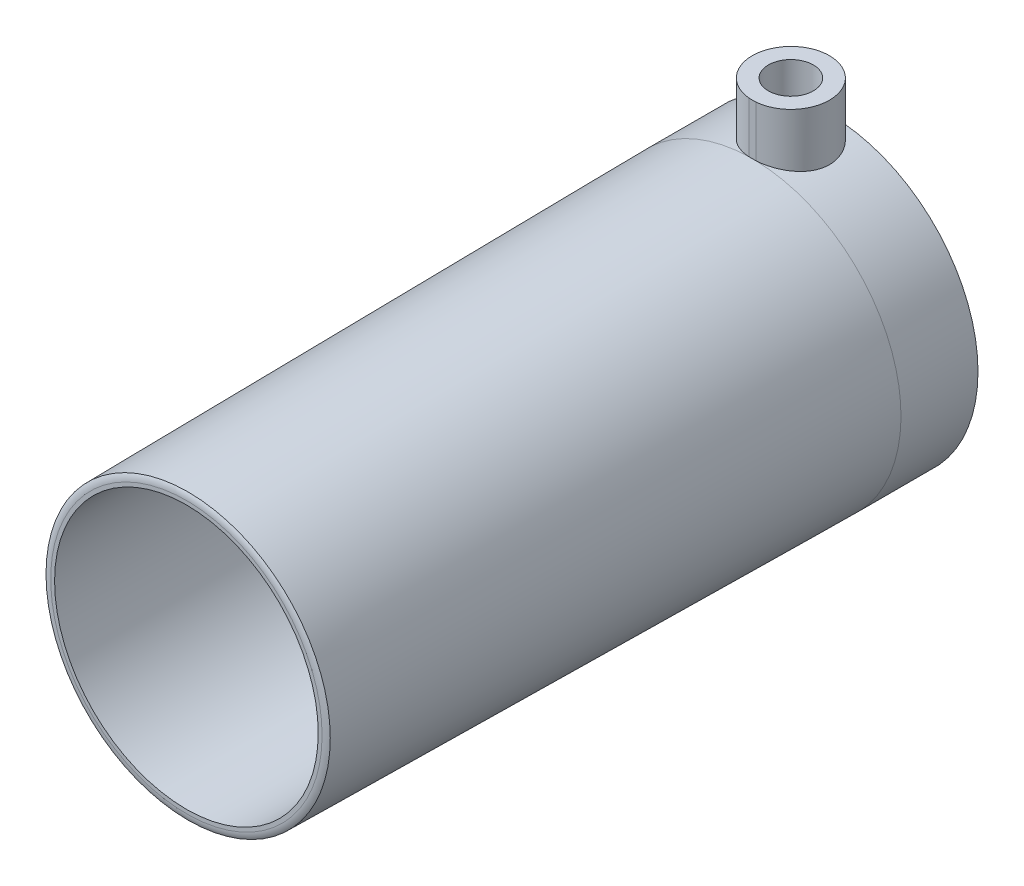
ISO-10303-21;
HEADER;
FILE_DESCRIPTION(('STEP AP214'),'2;1');
FILE_NAME('part.step','',(''),(''),'','','');
FILE_SCHEMA(('AUTOMOTIVE_DESIGN { 1 0 10303 214 1 1 1 1 }'));
ENDSEC;
DATA;
#1=APPLICATION_CONTEXT('core data for automotive mechanical design processes');
#2=APPLICATION_PROTOCOL_DEFINITION('international standard','automotive_design',2000,#1);
#3=PRODUCT_CONTEXT('',#1,'mechanical');
#4=PRODUCT('Part','Part','',(#3));
#5=PRODUCT_RELATED_PRODUCT_CATEGORY('part','',(#4));
#6=PRODUCT_DEFINITION_FORMATION('','',#4);
#7=PRODUCT_DEFINITION_CONTEXT('part definition',#1,'design');
#8=PRODUCT_DEFINITION('design','',#6,#7);
#9=PRODUCT_DEFINITION_SHAPE('','',#8);
#10=(LENGTH_UNIT() NAMED_UNIT(*) SI_UNIT(.MILLI.,.METRE.));
#11=(NAMED_UNIT(*) PLANE_ANGLE_UNIT() SI_UNIT($,.RADIAN.));
#12=(NAMED_UNIT(*) SI_UNIT($,.STERADIAN.) SOLID_ANGLE_UNIT());
#13=UNCERTAINTY_MEASURE_WITH_UNIT(LENGTH_MEASURE(1.E-05),#10,'distance_accuracy_value','');
#14=(GEOMETRIC_REPRESENTATION_CONTEXT(3) GLOBAL_UNCERTAINTY_ASSIGNED_CONTEXT((#13)) GLOBAL_UNIT_ASSIGNED_CONTEXT((#10,
#11,#12)) REPRESENTATION_CONTEXT('',''));
#15=CARTESIAN_POINT('',(0.,0.,0.));
#16=DIRECTION('',(0.,0.,1.));
#17=DIRECTION('',(1.,0.,0.));
#18=AXIS2_PLACEMENT_3D('',#15,#16,#17);
#19=CARTESIAN_POINT('',(0.,0.,100.));
#20=DIRECTION('',(0.,0.,-1.));
#21=DIRECTION('',(-1.,0.,0.));
#22=AXIS2_PLACEMENT_3D('',#19,#20,#21);
#23=CYLINDRICAL_SURFACE('',#22,23.1);
#24=CARTESIAN_POINT('',(0.,23.1,0.));
#25=CARTESIAN_POINT('',(-0.165590971193662,23.1000033344934,-5.35518259983517E-06));
#26=CARTESIAN_POINT('',(-0.33112499055556,23.0982169144309,0.00685592480967632));
#27=CARTESIAN_POINT('',(-0.661030895235251,23.0911284661715,0.0342299650651712));
#28=CARTESIAN_POINT('',(-0.825402660446663,23.0858260798523,0.0547441159558147));
#29=CARTESIAN_POINT('',(-1.15178290254947,23.0718464923373,0.109262589978207));
#30=CARTESIAN_POINT('',(-1.3137907400409,23.0631683950062,0.143270495286467));
#31=CARTESIAN_POINT('',(-1.63431832520702,23.0426734576403,0.224504741525706));
#32=CARTESIAN_POINT('',(-1.79283676328674,23.0308554602172,0.271735957003892));
#33=CARTESIAN_POINT('',(-2.1049667073609,23.0044258809035,0.378941236228669));
#34=CARTESIAN_POINT('',(-2.2585858677927,22.9898189338606,0.438894176386552));
#35=CARTESIAN_POINT('',(-2.56021914242264,22.9581855742689,0.571150488054531));
#36=CARTESIAN_POINT('',(-2.70823116187722,22.9411582685824,0.643458420685275));
#37=CARTESIAN_POINT('',(-2.99757832644708,22.9051473414502,0.799849953336694));
#38=CARTESIAN_POINT('',(-3.13891576371196,22.8861643988297,0.883929470912736));
#39=CARTESIAN_POINT('',(-3.41412560213961,22.8467302052023,1.06332717903448));
#40=CARTESIAN_POINT('',(-3.54799516542336,22.8262784026744,1.15864959973455));
#41=CARTESIAN_POINT('',(-3.80990901739636,22.7840411827221,1.36183267777111));
#42=CARTESIAN_POINT('',(-3.93778892210403,22.7622375420801,1.46990149429716));
#43=CARTESIAN_POINT('',(-4.18408667386697,22.7182542847428,1.6963486333101));
#44=CARTESIAN_POINT('',(-4.30250099190803,22.6960745315242,1.81473076680789));
#45=CARTESIAN_POINT('',(-4.52901878352585,22.6519602492384,2.06096874280303));
#46=CARTESIAN_POINT('',(-4.63712476840375,22.6300256615996,2.18882226433867));
#47=CARTESIAN_POINT('',(-4.84237672302797,22.5869960390746,2.45325333550688));
#48=CARTESIAN_POINT('',(-4.93951863053512,22.5659013172239,2.5898340894562));
#49=CARTESIAN_POINT('',(-5.12357451546836,22.5248311972553,2.87302867221965));
#50=CARTESIAN_POINT('',(-5.21030186762009,22.5048788544462,3.01976725953834));
#51=CARTESIAN_POINT('',(-5.37108653776012,22.4670481602831,3.32035470076489));
#52=CARTESIAN_POINT('',(-5.4451390545621,22.4491705956702,3.47420622112392));
#53=CARTESIAN_POINT('',(-5.57991539131063,22.4160517312993,3.78784332546131));
#54=CARTESIAN_POINT('',(-5.64064597169605,22.4008090952393,3.94762585129302));
#55=CARTESIAN_POINT('',(-5.74833679001229,22.3734141992353,4.27202076478242));
#56=CARTESIAN_POINT('',(-5.79529211197796,22.36126304275,4.4366348536782));
#57=CARTESIAN_POINT('',(-5.91305057834968,22.3305330908732,4.92877189248703));
#58=CARTESIAN_POINT('',(-5.96381923736484,22.3168941662465,5.26177578049617));
#59=CARTESIAN_POINT('',(-5.9977091255718,22.307788842108,5.76376310679579));
#60=CARTESIAN_POINT('',(-6.00195546600065,22.3066476406758,5.93157013966998));
#61=CARTESIAN_POINT('',(-5.99640224065119,22.3081415255425,6.26695528142369));
#62=CARTESIAN_POINT('',(-5.98660255383401,22.3107766443831,6.43453338831803));
#63=CARTESIAN_POINT('',(-5.93705327961186,22.3240412095715,6.926133212339));
#64=CARTESIAN_POINT('',(-5.87774660526282,22.3398735969893,7.24826133471414));
#65=CARTESIAN_POINT('',(-5.70796101759669,22.3838491779772,7.87765915444684));
#66=CARTESIAN_POINT('',(-5.59747820182715,22.4119933103741,8.18492771671029));
#67=CARTESIAN_POINT('',(-5.32726609595897,22.4777601147131,8.77994622679621));
#68=CARTESIAN_POINT('',(-5.16701857753113,22.5154817307646,9.06744995056467));
#69=CARTESIAN_POINT('',(-4.80218797808098,22.5961012679159,9.61199019637121));
#70=CARTESIAN_POINT('',(-4.59759657651588,22.6390001597925,9.86902098654554));
#71=CARTESIAN_POINT('',(-4.14239688839971,22.7267639880377,10.3536680227197));
#72=CARTESIAN_POINT('',(-3.89056285258569,22.7716487318296,10.5801310653492));
#73=CARTESIAN_POINT('',(-3.35194754542449,22.8571365154719,10.9878385800343));
#74=CARTESIAN_POINT('',(-3.06516503345578,22.897739403227,11.1690814461413));
#75=CARTESIAN_POINT('',(-2.46306694783088,22.9703175823708,11.4816768689414));
#76=CARTESIAN_POINT('',(-2.14764326630369,23.0022582032135,11.612829771763));
#77=CARTESIAN_POINT('',(-1.49820754167958,23.0536618502468,11.8199201996727));
#78=CARTESIAN_POINT('',(-1.16419936107903,23.0731274587233,11.8958691522308));
#79=CARTESIAN_POINT('',(-0.496926059234522,23.0970008516725,11.9886060011944));
#80=CARTESIAN_POINT('',(-0.163892965126738,23.10180790035,12.0069629771434));
#81=CARTESIAN_POINT('',(0.500490365438129,23.0969659166636,11.988315352029));
#82=CARTESIAN_POINT('',(0.831840763106455,23.0873182963891,11.9513161587592));
#83=CARTESIAN_POINT('',(1.47791500227641,23.0549080562859,11.8242966021679));
#84=CARTESIAN_POINT('',(1.79282106228187,23.0323600397174,11.7351433103876));
#85=CARTESIAN_POINT('',(2.40318369544935,22.976699330229,11.5073450298025));
#86=CARTESIAN_POINT('',(2.69863821465691,22.9435855237827,11.368694824346));
#87=CARTESIAN_POINT('',(3.26786837214201,22.8695221085103,11.0428774473916));
#88=CARTESIAN_POINT('',(3.5411311900568,22.8284367231709,10.8548460630205));
#89=CARTESIAN_POINT('',(4.05278199450715,22.7431825437095,10.4366813975085));
#90=CARTESIAN_POINT('',(4.29116344456352,22.6990131739593,10.2065402434832));
#91=CARTESIAN_POINT('',(4.73281745739942,22.6111160299583,9.70344387799583));
#92=CARTESIAN_POINT('',(4.93498513746379,22.5674313900394,9.42951116996765));
#93=CARTESIAN_POINT('',(5.29054401188716,22.4867421531345,8.85050106199441));
#94=CARTESIAN_POINT('',(5.44393731179001,22.4497372678197,8.54542500722946));
#95=CARTESIAN_POINT('',(5.63337945269746,22.4026596530521,8.07215787168723));
#96=CARTESIAN_POINT('',(5.68966382213905,22.3883967264562,7.91220323117818));
#97=CARTESIAN_POINT('',(5.78854795585899,22.3630351429941,7.58789025590354));
#98=CARTESIAN_POINT('',(5.83115294097036,22.3519352791052,7.42353362719702));
#99=CARTESIAN_POINT('',(5.90230399553967,22.3332522926066,7.09161812152249));
#100=CARTESIAN_POINT('',(5.93085005459387,22.3256691725993,6.92405924218488));
#101=CARTESIAN_POINT('',(5.97363232175377,22.3142602555883,6.58699977451459));
#102=CARTESIAN_POINT('',(5.98786923525893,22.3104342733688,6.41749928231448));
#103=CARTESIAN_POINT('',(6.00168389058807,22.3067217998155,6.08314384510501));
#104=CARTESIAN_POINT('',(6.00170359526212,22.3067165358045,5.91830829454127));
#105=CARTESIAN_POINT('',(5.98818749650133,22.3103487152634,5.58923702964712));
#106=CARTESIAN_POINT('',(5.97465201566056,22.3139860720442,5.42500130113516));
#107=CARTESIAN_POINT('',(5.93414026194278,22.3247937778621,5.09829070816489));
#108=CARTESIAN_POINT('',(5.90716197960805,22.3319646550954,4.93581611067521));
#109=CARTESIAN_POINT('',(5.84000496066206,22.3496206892443,4.61386373054505));
#110=CARTESIAN_POINT('',(5.79983086742773,22.3601046802836,4.45438491457993));
#111=CARTESIAN_POINT('',(5.70691943075746,22.3839976989102,4.14051615174255));
#112=CARTESIAN_POINT('',(5.65426725195231,22.3973868482459,3.98609945217393));
#113=CARTESIAN_POINT('',(5.53668877719655,22.4267417340091,3.6823300293741));
#114=CARTESIAN_POINT('',(5.47176672344004,22.4427065796354,3.53297557690413));
#115=CARTESIAN_POINT('',(5.3300821151908,22.4767776311702,3.24016478525328));
#116=CARTESIAN_POINT('',(5.25331416277645,22.4948848124133,3.0967111728931));
#117=CARTESIAN_POINT('',(5.0885239904093,22.5327331971767,2.81671478128699));
#118=CARTESIAN_POINT('',(5.00050542329341,22.5524738696067,2.68016977895809));
#119=CARTESIAN_POINT('',(4.81112566652018,22.5936433779676,2.41100133835447));
#120=CARTESIAN_POINT('',(4.7094565955667,22.6151042318365,2.27859932456933));
#121=CARTESIAN_POINT('',(4.49553545769871,22.6585980831307,2.02282150121021));
#122=CARTESIAN_POINT('',(4.38328696980326,22.6806308852512,1.89944266400065));
#123=CARTESIAN_POINT('',(4.14883978854604,22.724686126973,1.66238140820608));
#124=CARTESIAN_POINT('',(4.02663525019929,22.7467085527409,1.54870476692731));
#125=CARTESIAN_POINT('',(3.77316529907347,22.7901239172101,1.33191414690676));
#126=CARTESIAN_POINT('',(3.64190318824883,22.8115170812956,1.22879635261531));
#127=CARTESIAN_POINT('',(3.36835049527036,22.8535280938887,1.03178093443652));
#128=CARTESIAN_POINT('',(3.22588951870712,22.8741212114616,0.938114409357443));
#129=CARTESIAN_POINT('',(2.93338079331094,22.9134686926439,0.763177456835652));
#130=CARTESIAN_POINT('',(2.78333585769176,22.9322237305977,0.681902477126101));
#131=CARTESIAN_POINT('',(2.47669235266102,22.9673634501192,0.532361421855631));
#132=CARTESIAN_POINT('',(2.32009637458694,22.983749057722,0.464090260735977));
#133=CARTESIAN_POINT('',(2.00146722455376,23.0136866104515,0.341085575732397));
#134=CARTESIAN_POINT('',(1.83943482470553,23.0272389560133,0.286350138595311));
#135=CARTESIAN_POINT('',(1.40400178616187,23.0588917104969,0.159756747908308));
#136=CARTESIAN_POINT('',(1.12678554413921,23.0742073563013,0.0999574634725876));
#137=CARTESIAN_POINT('',(0.56632369967154,23.0947582060541,0.0200854199372189));
#138=CARTESIAN_POINT('',(0.283078631587476,23.0999942996661,9.15471274664216E-06));
#139=CARTESIAN_POINT('',(0.,23.1,0.));
#140=B_SPLINE_CURVE_WITH_KNOTS('',3,(#24,#25,#26,#27,#28,#29,#30,#31,#32,#33,#34,#35,#36,#37,
#38,#39,#40,#41,#42,#43,#44,#45,#46,#47,#48,#49,#50,#51,#52,#53,#54,#55,#56,#57,#58,#59,#60,#61,
#62,#63,#64,#65,#66,#67,#68,#69,#70,#71,#72,#73,#74,#75,#76,#77,#78,#79,#80,#81,#82,#83,#84,#85,
#86,#87,#88,#89,#90,#91,#92,#93,#94,#95,#96,#97,#98,#99,#100,#101,#102,#103,#104,#105,#106,#107,
#108,#109,#110,#111,#112,#113,#114,#115,#116,#117,#118,#119,#120,#121,#122,#123,#124,#125,#126,
#127,#128,#129,#130,#131,#132,#133,#134,#135,#136,#137,#138,#139),.UNSPECIFIED.,.T.,.F.,(4,2,2,
2,2,2,2,2,2,2,2,2,2,2,2,2,2,2,2,2,2,2,2,2,2,2,2,2,2,2,2,2,2,2,2,2,2,2,2,2,2,2,2,2,2,2,2,2,2,2,2,
2,2,2,2,2,2,4),(0.,0.496523264375219,0.993097110387728,1.48980286976652,1.98669197286699,
2.48276239151469,2.97901634285844,3.47509861520707,3.97136813806844,4.47730984940577,
4.9834393174907,5.48944516632889,5.99563788137727,6.50985787219034,7.02427221883797,
7.5384249103187,8.05276086446758,9.05816832830772,9.56125516442189,10.0643463358139,
11.0431139288604,12.0219561704217,13.0113543075197,14.0009382530486,15.0210758367583,
16.0412496444651,17.0654483541852,18.0894349896653,19.0852696860183,20.0810071047416,
21.0606426214303,22.0403814158073,23.0385641535508,24.0369337035748,25.0619082778513,
26.0868385989362,26.5968167560551,27.106600044429,27.6163837100472,28.1261422435738,
28.6200534785102,29.1139529593434,29.6079262914482,30.1017259887868,30.5922478594535,
31.0826004460131,31.5731771391747,32.0635949551231,32.5679372909811,33.0721096159814,
33.5765800927198,34.0808676256333,34.5954461479996,35.109835172408,35.624022613644,
36.1381373337034,36.9870213813489,37.835830499488),.UNSPECIFIED.);
#141=CARTESIAN_POINT('',(0.553970699099692,23.0933565439184,11.9743716376318));
#142=VERTEX_POINT('',#141);
#143=CARTESIAN_POINT('',(0.,23.1,0.));
#144=VERTEX_POINT('',#143);
#145=EDGE_CURVE('E55',#142,#144,#140,.T.);
#146=ORIENTED_EDGE('',*,*,#145,.F.);
#147=CARTESIAN_POINT('',(0.,0.,11.9743716376318));
#148=DIRECTION('',(0.,0.,1.));
#149=DIRECTION('',(1.,0.,0.));
#150=AXIS2_PLACEMENT_3D('',#147,#148,#149);
#151=CIRCLE('',#150,23.1);
#152=CARTESIAN_POINT('',(-0.553970699099691,23.0933565439184,11.9743716376318));
#153=VERTEX_POINT('',#152);
#154=EDGE_CURVE('E67',#153,#142,#151,.T.);
#155=ORIENTED_EDGE('',*,*,#154,.F.);
#156=EDGE_CURVE('E85',#144,#153,#140,.T.);
#157=ORIENTED_EDGE('',*,*,#156,.F.);
#158=CARTESIAN_POINT('',(0.,0.,0.));
#159=DIRECTION('',(0.,0.,1.));
#160=DIRECTION('',(1.,0.,0.));
#161=AXIS2_PLACEMENT_3D('',#158,#159,#160);
#162=CIRCLE('',#161,23.1);
#163=EDGE_CURVE('E84',#144,#144,#162,.T.);
#164=ORIENTED_EDGE('',*,*,#163,.T.);
#165=EDGE_LOOP('',(#146,#155,#157,#164));
#166=FACE_BOUND('',#165,.T.);
#167=ADVANCED_FACE('F34',(#166),#23,.T.);
#168=CARTESIAN_POINT('',(0.,0.,100.));
#169=DIRECTION('',(0.,0.,1.));
#170=DIRECTION('',(1.,0.,0.));
#171=AXIS2_PLACEMENT_3D('',#168,#169,#170);
#172=PLANE('',#171);
#173=CARTESIAN_POINT('',(0.,0.,100.));
#174=DIRECTION('',(0.,0.,1.));
#175=DIRECTION('',(1.,0.,0.));
#176=AXIS2_PLACEMENT_3D('',#173,#174,#175);
#177=CIRCLE('',#176,21.1);
#178=CARTESIAN_POINT('',(21.1,0.,100.));
#179=VERTEX_POINT('',#178);
#180=EDGE_CURVE('E42',#179,#179,#177,.T.);
#181=ORIENTED_EDGE('',*,*,#180,.T.);
#182=EDGE_LOOP('',(#181));
#183=FACE_BOUND('',#182,.T.);
#184=CARTESIAN_POINT('',(0.,0.,100.));
#185=DIRECTION('',(0.,0.,1.));
#186=DIRECTION('',(1.,0.,0.));
#187=AXIS2_PLACEMENT_3D('',#184,#185,#186);
#188=CIRCLE('',#187,20.5);
#189=CARTESIAN_POINT('',(20.5,0.,100.));
#190=VERTEX_POINT('',#189);
#191=EDGE_CURVE('E87',#190,#190,#188,.T.);
#192=ORIENTED_EDGE('',*,*,#191,.F.);
#193=EDGE_LOOP('',(#192));
#194=FACE_BOUND('',#193,.T.);
#195=ADVANCED_FACE('F109',(#183,#194),#172,.T.);
#196=CARTESIAN_POINT('',(0.,0.,0.));
#197=DIRECTION('',(0.,0.,1.));
#198=DIRECTION('',(1.,0.,0.));
#199=AXIS2_PLACEMENT_3D('',#196,#197,#198);
#200=PLANE('',#199);
#201=ORIENTED_EDGE('',*,*,#163,.F.);
#202=EDGE_LOOP('',(#201));
#203=FACE_BOUND('',#202,.T.);
#204=CARTESIAN_POINT('',(0.,0.,0.));
#205=DIRECTION('',(0.,0.,1.));
#206=DIRECTION('',(1.,0.,0.));
#207=AXIS2_PLACEMENT_3D('',#204,#205,#206);
#208=CIRCLE('',#207,20.5);
#209=CARTESIAN_POINT('',(20.5,0.,0.));
#210=VERTEX_POINT('',#209);
#211=EDGE_CURVE('E146',#210,#210,#208,.T.);
#212=ORIENTED_EDGE('',*,*,#211,.T.);
#213=EDGE_LOOP('',(#212));
#214=FACE_BOUND('',#213,.T.);
#215=ADVANCED_FACE('F107',(#203,#214),#200,.F.);
#216=CARTESIAN_POINT('',(0.,0.,100.));
#217=DIRECTION('',(0.,0.,-1.));
#218=DIRECTION('',(-1.,0.,0.));
#219=AXIS2_PLACEMENT_3D('',#216,#217,#218);
#220=CYLINDRICAL_SURFACE('',#219,20.5);
#221=CARTESIAN_POINT('',(0.,20.5,9.5));
#222=CARTESIAN_POINT('',(-0.19507649871543,20.4999966128791,9.4999922416386));
#223=CARTESIAN_POINT('',(-0.390257704170464,20.4971865424055,9.48363568417139));
#224=CARTESIAN_POINT('',(-0.77514106704659,20.4862472556081,9.41867159673813));
#225=CARTESIAN_POINT('',(-0.964838100754703,20.478113222915,9.37003486366921));
#226=CARTESIAN_POINT('',(-1.33312937628795,20.4574378968584,9.24202574683243));
#227=CARTESIAN_POINT('',(-1.51173273385533,20.4449002798729,9.16267899602549));
#228=CARTESIAN_POINT('',(-1.85306952802105,20.4167945666518,8.97557040724814));
#229=CARTESIAN_POINT('',(-2.01580467731815,20.4012267980133,8.8678116405242));
#230=CARTESIAN_POINT('',(-2.3224364340935,20.3686109084319,8.62579073429222));
#231=CARTESIAN_POINT('',(-2.46615113480557,20.3515507706433,8.4912997204989));
#232=CARTESIAN_POINT('',(-2.72909069277061,20.3179643775086,8.20012462114838));
#233=CARTESIAN_POINT('',(-2.84831396612315,20.30143815675,8.04343910134282));
#234=CARTESIAN_POINT('',(-3.0596205483248,20.2706743195951,7.71106636827231));
#235=CARTESIAN_POINT('',(-3.15152300769953,20.2564522252273,7.53526261736013));
#236=CARTESIAN_POINT('',(-3.30442246126968,20.2320741514135,7.17042918007678));
#237=CARTESIAN_POINT('',(-3.36542164922435,20.2219178833537,6.98140043360516));
#238=CARTESIAN_POINT('',(-3.45420786752049,20.206941277453,6.5974145997369));
#239=CARTESIAN_POINT('',(-3.48230956029586,20.2020704184502,6.40253227748069));
#240=CARTESIAN_POINT('',(-3.50547890094729,20.1980633997682,6.01076231690134));
#241=CARTESIAN_POINT('',(-3.50054900203133,20.1989268142129,5.81387482858335));
#242=CARTESIAN_POINT('',(-3.45805118790804,20.2062446844592,5.4259358583856));
#243=CARTESIAN_POINT('',(-3.42083755044877,20.2126384486438,5.23484425425421));
#244=CARTESIAN_POINT('',(-3.31538496451563,20.2302015393177,4.86165732725645));
#245=CARTESIAN_POINT('',(-3.24714490414934,20.241371036954,4.67956232706024));
#246=CARTESIAN_POINT('',(-3.08121975291467,20.2672922411909,4.32848149966092));
#247=CARTESIAN_POINT('',(-2.98338830693513,20.2820616804639,4.15956620481225));
#248=CARTESIAN_POINT('',(-2.76116129362428,20.3135064262175,3.84041505925035));
#249=CARTESIAN_POINT('',(-2.6367634789611,20.3301818938796,3.69018079052555));
#250=CARTESIAN_POINT('',(-2.36300839763105,20.3638260583027,3.41060626426861));
#251=CARTESIAN_POINT('',(-2.21334733697768,20.3807957466595,3.28156341162632));
#252=CARTESIAN_POINT('',(-1.89433949993095,20.4129158871524,3.05037617497861));
#253=CARTESIAN_POINT('',(-1.72499258481536,20.4280663264671,2.94823198053913));
#254=CARTESIAN_POINT('',(-1.37113485210553,20.4548640338966,2.77371139992861));
#255=CARTESIAN_POINT('',(-1.18661039269493,20.4665081056432,2.70136215257292));
#256=CARTESIAN_POINT('',(-0.807785938863901,20.4849556445686,2.58876577159234));
#257=CARTESIAN_POINT('',(-0.613486804713577,20.4917595369369,2.54851581814158));
#258=CARTESIAN_POINT('',(-0.223190915105119,20.499702699914,2.50166574804693));
#259=CARTESIAN_POINT('',(-0.0272445000789764,20.5009106704561,2.49465750435371));
#260=CARTESIAN_POINT('',(0.363022197862534,20.4977143471939,2.5134004665754));
#261=CARTESIAN_POINT('',(0.557342546226921,20.4933102803779,2.53915034753291));
#262=CARTESIAN_POINT('',(0.937574125093547,20.4794273055007,2.62233916973177));
#263=CARTESIAN_POINT('',(1.12353103368016,20.4699809002191,2.67957522342314));
#264=CARTESIAN_POINT('',(1.48320983583377,20.4470681386571,2.82389477665452));
#265=CARTESIAN_POINT('',(1.65693101373051,20.4336015474761,2.91098002033468));
#266=CARTESIAN_POINT('',(1.98897406666136,20.4039715824641,3.11345478881738));
#267=CARTESIAN_POINT('',(2.14713895272185,20.3877844575352,3.22909821999028));
#268=CARTESIAN_POINT('',(2.44196340914496,20.3545785020759,3.48505846856445));
#269=CARTESIAN_POINT('',(2.57862133379808,20.3375596080291,3.62537717237607));
#270=CARTESIAN_POINT('',(2.82807261416899,20.3043850221399,3.92853859838238));
#271=CARTESIAN_POINT('',(2.94058968586533,20.2882407577173,4.09161010592245));
#272=CARTESIAN_POINT('',(3.13663335419298,20.2588597570836,4.43457928875246));
#273=CARTESIAN_POINT('',(3.22016090208285,20.2456229254738,4.61447641168283));
#274=CARTESIAN_POINT('',(3.35544523754132,20.2236420011616,4.98523097047515));
#275=CARTESIAN_POINT('',(3.40733751084549,20.2148787757838,5.17603778314121));
#276=CARTESIAN_POINT('',(3.47830316446103,20.202790041071,5.56382234684663));
#277=CARTESIAN_POINT('',(3.49737955326874,20.1994640332639,5.76079953051235));
#278=CARTESIAN_POINT('',(3.50208487197523,20.1986485203799,6.15257298532412));
#279=CARTESIAN_POINT('',(3.48814884097166,20.2010831015291,6.34736400950091));
#280=CARTESIAN_POINT('',(3.42816779886109,20.2113477114971,6.73178571949466));
#281=CARTESIAN_POINT('',(3.38212290691322,20.2191777202929,6.92141642445935));
#282=CARTESIAN_POINT('',(3.25940106541126,20.2393215031328,7.28995404978911));
#283=CARTESIAN_POINT('',(3.18276338078975,20.2516295279906,7.46887437940112));
#284=CARTESIAN_POINT('',(3.001076591274,20.2793478010238,7.81138829309284));
#285=CARTESIAN_POINT('',(2.8960259636525,20.2947582154533,7.97498105509347));
#286=CARTESIAN_POINT('',(2.65895011440886,20.3271846476278,8.28439056291388));
#287=CARTESIAN_POINT('',(2.52660545698282,20.3442182607236,8.42996074299654));
#288=CARTESIAN_POINT('',(2.23937072323712,20.3778331491673,8.69697509141691));
#289=CARTESIAN_POINT('',(2.0844754578089,20.3944143193582,8.81841369159772));
#290=CARTESIAN_POINT('',(1.75519303616748,20.425396397203,9.03452984350336));
#291=CARTESIAN_POINT('',(1.58067212286664,20.4397805445916,9.12900603061748));
#292=CARTESIAN_POINT('',(1.21805923220155,20.4645847857031,9.28715348416475));
#293=CARTESIAN_POINT('',(1.02998084010191,20.4750087837636,9.35085510836929));
#294=CARTESIAN_POINT('',(0.701002627013386,20.4884710780508,9.4319834463098));
#295=CARTESIAN_POINT('',(0.562081309590442,20.4927710747388,9.45744830345628));
#296=CARTESIAN_POINT('',(0.282124892427427,20.4985367342234,9.49145922855975));
#297=CARTESIAN_POINT('',(0.141089832060219,20.5000024497483,9.50000561126488));
#298=CARTESIAN_POINT('',(0.,20.5,9.5));
#299=B_SPLINE_CURVE_WITH_KNOTS('',3,(#221,#222,#223,#224,#225,#226,#227,#228,#229,#230,#231,
#232,#233,#234,#235,#236,#237,#238,#239,#240,#241,#242,#243,#244,#245,#246,#247,#248,#249,#250,
#251,#252,#253,#254,#255,#256,#257,#258,#259,#260,#261,#262,#263,#264,#265,#266,#267,#268,#269,
#270,#271,#272,#273,#274,#275,#276,#277,#278,#279,#280,#281,#282,#283,#284,#285,#286,#287,#288,
#289,#290,#291,#292,#293,#294,#295,#296,#297,#298),.UNSPECIFIED.,.T.,.F.,(4,2,2,2,2,2,2,2,2,2,2,
2,2,2,2,2,2,2,2,2,2,2,2,2,2,2,2,2,2,2,2,2,2,2,2,2,2,2,4),(0.,0.584713726284822,1.16995715144791,
1.75471313691305,2.33940593805503,2.92933889806911,3.51930999800439,4.11310362263703,
4.7068550891813,5.29487971745115,5.88286067447645,6.4644696711794,7.04609951261872,
7.63065440898298,8.21525877426762,8.80747226307129,9.39968992533603,9.992445824047,
10.5851496452076,11.1705573389669,11.7559413556812,12.3375967799776,12.919286197209,
13.5063462833392,14.0934512694012,14.6869540352125,15.2804373240574,15.871360685848,
16.4622298700488,17.0453559584351,17.6284798827951,18.2108577790985,18.7932668928113,
19.3829242556694,19.9727175193654,20.5668067133178,21.160308661297,21.5832129926382,
22.0061094562721),.UNSPECIFIED.);
#300=CARTESIAN_POINT('',(0.,20.5,9.5));
#301=VERTEX_POINT('',#300);
#302=EDGE_CURVE('E111',#301,#301,#299,.T.);
#303=ORIENTED_EDGE('',*,*,#302,.F.);
#304=EDGE_LOOP('',(#303));
#305=FACE_BOUND('',#304,.T.);
#306=ORIENTED_EDGE('',*,*,#191,.T.);
#307=EDGE_LOOP('',(#306));
#308=FACE_BOUND('',#307,.T.);
#309=ORIENTED_EDGE('',*,*,#211,.F.);
#310=EDGE_LOOP('',(#309));
#311=FACE_BOUND('',#310,.T.);
#312=ADVANCED_FACE('F102',(#305,#308,#311),#220,.F.);
#313=CARTESIAN_POINT('',(0.,31.,6.));
#314=DIRECTION('',(0.,-1.,0.));
#315=DIRECTION('',(0.,0.,-1.));
#316=AXIS2_PLACEMENT_3D('',#313,#314,#315);
#317=CYLINDRICAL_SURFACE('',#316,6.);
#318=CARTESIAN_POINT('',(0.,31.,6.));
#319=DIRECTION('',(0.,1.,0.));
#320=DIRECTION('',(0.,0.,1.));
#321=AXIS2_PLACEMENT_3D('',#318,#319,#320);
#322=CIRCLE('',#321,6.);
#323=CARTESIAN_POINT('',(0.553970699099692,31.,11.9743716376318));
#324=VERTEX_POINT('',#323);
#325=CARTESIAN_POINT('',(-0.553970699099691,31.,11.9743716376318));
#326=VERTEX_POINT('',#325);
#327=EDGE_CURVE('E80',#324,#326,#322,.T.);
#328=ORIENTED_EDGE('',*,*,#327,.F.);
#329=DIRECTION('',(0.,-1.,0.));
#330=VECTOR('',#329,1.);
#331=CARTESIAN_POINT('',(0.553970699099692,31.,11.9743716376318));
#332=LINE('',#331,#330);
#333=EDGE_CURVE('E48',#324,#142,#332,.T.);
#334=ORIENTED_EDGE('',*,*,#333,.T.);
#335=ORIENTED_EDGE('',*,*,#145,.T.);
#336=ORIENTED_EDGE('',*,*,#156,.T.);
#337=DIRECTION('',(0.,-1.,0.));
#338=VECTOR('',#337,1.);
#339=CARTESIAN_POINT('',(-0.553970699099691,31.,11.9743716376318));
#340=LINE('',#339,#338);
#341=EDGE_CURVE('E75',#153,#326,#340,.F.);
#342=ORIENTED_EDGE('',*,*,#341,.T.);
#343=EDGE_LOOP('',(#328,#334,#335,#336,#342));
#344=FACE_BOUND('',#343,.T.);
#345=ADVANCED_FACE('F78',(#344),#317,.T.);
#346=CARTESIAN_POINT('',(0.,31.,6.));
#347=DIRECTION('',(0.,1.,0.));
#348=DIRECTION('',(0.,0.,1.));
#349=AXIS2_PLACEMENT_3D('',#346,#347,#348);
#350=PLANE('',#349);
#351=DIRECTION('',(-1.,0.,0.));
#352=VECTOR('',#351,1.);
#353=CARTESIAN_POINT('',(0.,31.,11.9743716376318));
#354=LINE('',#353,#352);
#355=EDGE_CURVE('E11',#324,#326,#354,.T.);
#356=ORIENTED_EDGE('',*,*,#355,.F.);
#357=ORIENTED_EDGE('',*,*,#327,.T.);
#358=EDGE_LOOP('',(#356,#357));
#359=FACE_BOUND('',#358,.T.);
#360=CARTESIAN_POINT('',(0.,31.,6.));
#361=DIRECTION('',(0.,1.,0.));
#362=DIRECTION('',(0.,0.,1.));
#363=AXIS2_PLACEMENT_3D('',#360,#361,#362);
#364=CIRCLE('',#363,3.5);
#365=CARTESIAN_POINT('',(0.,31.,9.5));
#366=VERTEX_POINT('',#365);
#367=EDGE_CURVE('E81',#366,#366,#364,.T.);
#368=ORIENTED_EDGE('',*,*,#367,.F.);
#369=EDGE_LOOP('',(#368));
#370=FACE_BOUND('',#369,.T.);
#371=ADVANCED_FACE('F101',(#359,#370),#350,.T.);
#372=CARTESIAN_POINT('',(0.,11.,6.));
#373=DIRECTION('',(0.,1.,0.));
#374=DIRECTION('',(0.,0.,1.));
#375=AXIS2_PLACEMENT_3D('',#372,#373,#374);
#376=CYLINDRICAL_SURFACE('',#375,3.5);
#377=ORIENTED_EDGE('',*,*,#302,.T.);
#378=EDGE_LOOP('',(#377));
#379=FACE_BOUND('',#378,.T.);
#380=ORIENTED_EDGE('',*,*,#367,.T.);
#381=EDGE_LOOP('',(#380));
#382=FACE_BOUND('',#381,.T.);
#383=ADVANCED_FACE('F119',(#379,#382),#376,.F.);
#384=CARTESIAN_POINT('',(0.,0.,98.));
#385=DIRECTION('',(0.,0.,1.));
#386=DIRECTION('',(1.,0.,0.));
#387=AXIS2_PLACEMENT_3D('',#384,#385,#386);
#388=TOROIDAL_SURFACE('',#387,21.1,2.);
#389=CARTESIAN_POINT('',(0.,0.,99.7302781139375));
#390=DIRECTION('',(0.,0.,-1.));
#391=DIRECTION('',(-1.,0.,0.));
#392=AXIS2_PLACEMENT_3D('',#389,#390,#391);
#393=CIRCLE('',#392,22.103064129062);
#394=CARTESIAN_POINT('',(-22.103064129062,0.,99.7302781139375));
#395=VERTEX_POINT('',#394);
#396=EDGE_CURVE('E76',#395,#395,#393,.T.);
#397=ORIENTED_EDGE('',*,*,#396,.F.);
#398=EDGE_LOOP('',(#397));
#399=FACE_BOUND('',#398,.T.);
#400=ORIENTED_EDGE('',*,*,#180,.F.);
#401=EDGE_LOOP('',(#400));
#402=FACE_BOUND('',#401,.T.);
#403=ADVANCED_FACE('F36',(#399,#402),#388,.T.);
#404=CARTESIAN_POINT('',(36.7199143863533,0.,11.9743716376318));
#405=DIRECTION('',(0.,0.,-1.));
#406=DIRECTION('',(-1.,0.,0.));
#407=AXIS2_PLACEMENT_3D('',#404,#405,#406);
#408=PLANE('',#407);
#409=ORIENTED_EDGE('',*,*,#355,.T.);
#410=ORIENTED_EDGE('',*,*,#341,.F.);
#411=EDGE_CURVE('E69',#142,#153,#151,.T.);
#412=ORIENTED_EDGE('',*,*,#411,.F.);
#413=ORIENTED_EDGE('',*,*,#333,.F.);
#414=EDGE_LOOP('',(#409,#410,#412,#413));
#415=FACE_BOUND('',#414,.T.);
#416=ADVANCED_FACE('F73',(#415),#408,.F.);
#417=CARTESIAN_POINT('',(0.,0.,11.9743716376318));
#418=DIRECTION('',(0.,0.,-1.));
#419=DIRECTION('',(-1.,0.,0.));
#420=AXIS2_PLACEMENT_3D('',#417,#418,#419);
#421=CONICAL_SURFACE('',#420,23.1,0.0113598392072577);
#422=ORIENTED_EDGE('',*,*,#396,.T.);
#423=EDGE_LOOP('',(#422));
#424=FACE_BOUND('',#423,.T.);
#425=ORIENTED_EDGE('',*,*,#411,.T.);
#426=ORIENTED_EDGE('',*,*,#154,.T.);
#427=EDGE_LOOP('',(#425,#426));
#428=FACE_BOUND('',#427,.T.);
#429=ADVANCED_FACE('F68',(#424,#428),#421,.T.);
#430=CLOSED_SHELL('',(#167,#195,#215,#312,#345,#371,#383,#403,#416,#429));
#431=MANIFOLD_SOLID_BREP('B2',#430);
#432=ADVANCED_BREP_SHAPE_REPRESENTATION('',(#18,#431),#14);
#433=SHAPE_DEFINITION_REPRESENTATION(#9,#432);
ENDSEC;
END-ISO-10303-21;
